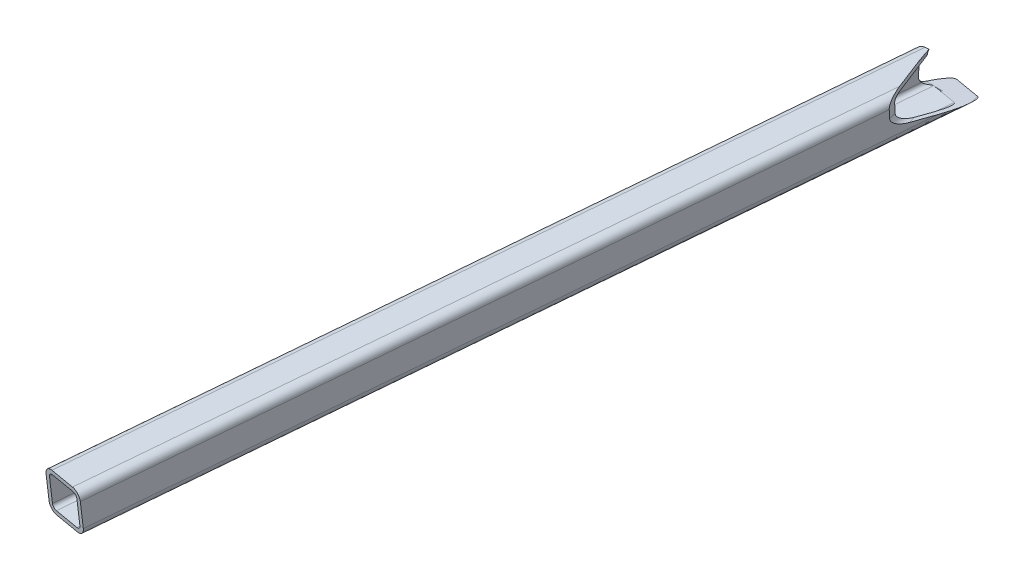
ISO-10303-21;
HEADER;
FILE_DESCRIPTION(('STEP AP214'),'2;1');
FILE_NAME('part.step','',(''),(''),'','','');
FILE_SCHEMA(('AUTOMOTIVE_DESIGN { 1 0 10303 214 1 1 1 1 }'));
ENDSEC;
DATA;
#1=APPLICATION_CONTEXT('core data for automotive mechanical design processes');
#2=APPLICATION_PROTOCOL_DEFINITION('international standard','automotive_design',2000,#1);
#3=PRODUCT_CONTEXT('',#1,'mechanical');
#4=PRODUCT('Part','Part','',(#3));
#5=PRODUCT_RELATED_PRODUCT_CATEGORY('part','',(#4));
#6=PRODUCT_DEFINITION_FORMATION('','',#4);
#7=PRODUCT_DEFINITION_CONTEXT('part definition',#1,'design');
#8=PRODUCT_DEFINITION('design','',#6,#7);
#9=PRODUCT_DEFINITION_SHAPE('','',#8);
#10=(LENGTH_UNIT() NAMED_UNIT(*) SI_UNIT(.MILLI.,.METRE.));
#11=(NAMED_UNIT(*) PLANE_ANGLE_UNIT() SI_UNIT($,.RADIAN.));
#12=(NAMED_UNIT(*) SI_UNIT($,.STERADIAN.) SOLID_ANGLE_UNIT());
#13=UNCERTAINTY_MEASURE_WITH_UNIT(LENGTH_MEASURE(1.E-05),#10,'distance_accuracy_value','');
#14=(GEOMETRIC_REPRESENTATION_CONTEXT(3) GLOBAL_UNCERTAINTY_ASSIGNED_CONTEXT((#13)) GLOBAL_UNIT_ASSIGNED_CONTEXT((#10,
#11,#12)) REPRESENTATION_CONTEXT('',''));
#15=CARTESIAN_POINT('',(0.,0.,0.));
#16=DIRECTION('',(0.,0.,1.));
#17=DIRECTION('',(1.,0.,0.));
#18=AXIS2_PLACEMENT_3D('',#15,#16,#17);
#19=CARTESIAN_POINT('',(54.1032900351574,-73.9281460624987,-1680.60116665924));
#20=DIRECTION('',(0.329210313393401,0.229015870186713,-0.916063480746854));
#21=DIRECTION('',(-0.941074716280074,0.,-0.338198726163151));
#22=AXIS2_PLACEMENT_3D('',#19,#20,#21);
#23=CYLINDRICAL_SURFACE('',#22,4.);
#24=CARTESIAN_POINT('',(165.293495766993,3.42156227269108,-1990.));
#25=DIRECTION('',(0.,0.,-1.));
#26=DIRECTION('',(0.820905201785487,0.5710644881986,0.));
#27=AXIS2_PLACEMENT_3D('',#24,#25,#26);
#28=ELLIPSE('',#27,4.36650961867715,4.);
#29=CARTESIAN_POINT('',(161.046510304216,3.24974629858509,-1990.));
#30=VERTEX_POINT('',#29);
#31=CARTESIAN_POINT('',(162.205924152796,6.00000000000001,-1990.));
#32=VERTEX_POINT('',#31);
#33=EDGE_CURVE('E530',#30,#32,#28,.T.);
#34=ORIENTED_EDGE('',*,*,#33,.F.);
#35=DIRECTION('',(0.329210313393401,0.229015870186713,-0.916063480746854));
#36=VECTOR('',#35,1.);
#37=CARTESIAN_POINT('',(50.3295443978832,-73.7707517232112,-1681.91800791281));
#38=LINE('',#37,#36);
#39=CARTESIAN_POINT('',(49.9999999999999,-73.9999999999996,-1681.00101480566));
#40=VERTEX_POINT('',#39);
#41=EDGE_CURVE('E271',#40,#30,#38,.T.);
#42=ORIENTED_EDGE('',*,*,#41,.F.);
#43=CARTESIAN_POINT('',(53.9999999999999,-73.9999999999996,-1680.31375090924));
#44=DIRECTION('',(-0.168171921974834,-0.116989163112928,0.978790958465303));
#45=DIRECTION('',(0.80349458926477,0.558952757749405,0.204861562101271));
#46=AXIS2_PLACEMENT_3D('',#43,#44,#45);
#47=ELLIPSE('',#46,4.08667444810873,4.);
#48=CARTESIAN_POINT('',(54.,-69.9999999999996,-1679.83565428564));
#49=VERTEX_POINT('',#48);
#50=EDGE_CURVE('E310',#49,#40,#47,.T.);
#51=ORIENTED_EDGE('',*,*,#50,.F.);
#52=DIRECTION('',(0.329210313393401,0.229015870186713,-0.916063480746854));
#53=VECTOR('',#52,1.);
#54=CARTESIAN_POINT('',(53.94589569587,-70.0376377767856,-1679.68510317849));
#55=LINE('',#54,#53);
#56=CARTESIAN_POINT('',(165.589697193477,7.62761543894062,-1990.3461160414));
#57=VERTEX_POINT('',#56);
#58=EDGE_CURVE('E274',#49,#57,#55,.T.);
#59=ORIENTED_EDGE('',*,*,#58,.T.);
#60=CARTESIAN_POINT('',(162.205924152796,6.00000000000001,-1990.));
#61=CARTESIAN_POINT('',(162.297465743592,6.1007657122807,-1990.00003387805));
#62=CARTESIAN_POINT('',(162.393493529026,6.19723632581697,-1990.00380646283));
#63=CARTESIAN_POINT('',(162.593031896537,6.38134727203625,-1990.01714341719));
#64=CARTESIAN_POINT('',(162.696529720715,6.46900207550127,-1990.02669810857));
#65=CARTESIAN_POINT('',(162.910387881736,6.63601157864657,-1990.04998536255));
#66=CARTESIAN_POINT('',(163.020781119878,6.71532072401793,-1990.06373940216));
#67=CARTESIAN_POINT('',(163.247124091024,6.8650970166377,-1990.09392167442));
#68=CARTESIAN_POINT('',(163.363076368465,6.93556006048673,-1990.11035114006));
#69=CARTESIAN_POINT('',(163.599098139199,7.06701379623975,-1990.14434717654));
#70=CARTESIAN_POINT('',(163.719137329081,7.12806100180455,-1990.16190598873));
#71=CARTESIAN_POINT('',(163.963541515791,7.24085913002822,-1990.19687569133));
#72=CARTESIAN_POINT('',(164.087906663519,7.29260972800837,-1990.21428657657));
#73=CARTESIAN_POINT('',(164.34001675291,7.38602889253068,-1990.2474845087));
#74=CARTESIAN_POINT('',(164.467746101468,7.42773714489654,-1990.26327780088));
#75=CARTESIAN_POINT('',(164.726489803195,7.5004562692102,-1990.29187946547));
#76=CARTESIAN_POINT('',(164.857501843146,7.5314744586902,-1990.30468987776));
#77=CARTESIAN_POINT('',(165.088591864016,7.57535323428185,-1990.32322337915));
#78=CARTESIAN_POINT('',(165.188095803454,7.59082324756154,-1990.3299198235));
#79=CARTESIAN_POINT('',(165.388208205972,7.61467927402099,-1990.34036302645));
#80=CARTESIAN_POINT('',(165.488817782184,7.62305732658316,-1990.34410647004));
#81=CARTESIAN_POINT('',(165.589697193477,7.62761543894065,-1990.3461160414));
#82=B_SPLINE_CURVE_WITH_KNOTS('',3,(#60,#61,#62,#63,#64,#65,#66,#67,#68,#69,#70,#71,#72,#73,#74,
#75,#76,#77,#78,#79,#80,#81),.UNSPECIFIED.,.F.,.F.,(4,2,2,2,2,2,2,2,2,2,4),(0.,0.40798949569844,
0.81529797214759,1.22472549541877,1.63434224163022,2.04139583532081,2.44846364236358,
2.85389535824415,3.25904899533167,3.56153390662927,3.86435790407479),.UNSPECIFIED.);
#83=EDGE_CURVE('E361',#32,#57,#82,.T.);
#84=ORIENTED_EDGE('',*,*,#83,.F.);
#85=EDGE_LOOP('',(#34,#42,#51,#59,#84));
#86=FACE_BOUND('',#85,.T.);
#87=ADVANCED_FACE('F41',(#86),#23,.T.);
#88=CARTESIAN_POINT('',(50.8017274157454,-85.4422765803505,-1684.66619835505));
#89=DIRECTION('',(0.94343640931858,-0.039348584821857,0.329210313393401));
#90=DIRECTION('',(0.329465469723453,0.,-0.944167625085665));
#91=AXIS2_PLACEMENT_3D('',#88,#89,#90);
#92=PLANE('',#91);
#93=CARTESIAN_POINT('',(162.056516720495,-6.00000000000001,-1994.));
#94=DIRECTION('',(0.94343640931858,-0.039348584821857,0.329210313393401));
#95=DIRECTION('',(-0.33155352746135,-0.111966498623448,0.936768787702676));
#96=AXIS2_PLACEMENT_3D('',#93,#94,#95);
#97=ELLIPSE('',#96,4.23981940965062,4.);
#98=CARTESIAN_POINT('',(160.948514442533,-8.81842473562878,-1991.16160573394));
#99=VERTEX_POINT('',#98);
#100=CARTESIAN_POINT('',(160.660724443912,-6.,-1990.));
#101=VERTEX_POINT('',#100);
#102=EDGE_CURVE('E282',#99,#101,#97,.F.);
#103=ORIENTED_EDGE('',*,*,#102,.F.);
#104=DIRECTION('',(0.329210313393401,0.229015870186713,-0.916063480746854));
#105=VECTOR('',#104,1.);
#106=CARTESIAN_POINT('',(50.8017274157454,-85.4422765803505,-1684.66619835505));
#107=LINE('',#106,#105);
#108=CARTESIAN_POINT('',(50.,-85.9999999999995,-1682.43530467646));
#109=VERTEX_POINT('',#108);
#110=EDGE_CURVE('E268',#109,#99,#107,.T.);
#111=ORIENTED_EDGE('',*,*,#110,.F.);
#112=DIRECTION('',(0.,-0.992932622114171,-0.118679433523578));
#113=VECTOR('',#112,1.);
#114=CARTESIAN_POINT('',(50.,-85.7130220381919,-1682.40100387781));
#115=LINE('',#114,#113);
#116=EDGE_CURVE('E313',#40,#109,#115,.T.);
#117=ORIENTED_EDGE('',*,*,#116,.F.);
#118=ORIENTED_EDGE('',*,*,#41,.T.);
#119=DIRECTION('',(0.0416714946710183,0.999131366003432,0.));
#120=VECTOR('',#119,1.);
#121=CARTESIAN_POINT('',(157.162350004895,-89.8783360098117,-1990.));
#122=LINE('',#121,#120);
#123=EDGE_CURVE('E531',#101,#30,#122,.T.);
#124=ORIENTED_EDGE('',*,*,#123,.F.);
#125=EDGE_LOOP('',(#103,#111,#117,#118,#124));
#126=FACE_BOUND('',#125,.T.);
#127=ADVANCED_FACE('F357',(#126),#92,.F.);
#128=CARTESIAN_POINT('',(54.5754730530198,-85.599670919638,-1683.34935710148));
#129=DIRECTION('',(0.329210313393401,0.229015870186713,-0.916063480746854));
#130=DIRECTION('',(-0.941074716280074,0.,-0.338198726163151));
#131=AXIS2_PLACEMENT_3D('',#128,#129,#130);
#132=CYLINDRICAL_SURFACE('',#131,4.);
#133=CARTESIAN_POINT('',(162.373354768369,-10.,-1994.));
#134=CARTESIAN_POINT('',(162.312482268875,-9.99996135996605,-1993.87489935749));
#135=CARTESIAN_POINT('',(162.249658701786,-9.99413083001993,-1993.75081611515));
#136=CARTESIAN_POINT('',(162.12173329001,-9.97116634251972,-1993.5048445865));
#137=CARTESIAN_POINT('',(162.056630920958,-9.95402976696814,-1993.38295681528));
#138=CARTESIAN_POINT('',(161.924963897282,-9.90844383026138,-1993.14004928697));
#139=CARTESIAN_POINT('',(161.85839119264,-9.87985242714997,-1993.01906062743));
#140=CARTESIAN_POINT('',(161.726361952706,-9.81136374272716,-1992.77975927288));
#141=CARTESIAN_POINT('',(161.660905134617,-9.77146937244745,-1992.66144589734));
#142=CARTESIAN_POINT('',(161.498933104693,-9.65594730864718,-1992.36568495085));
#143=CARTESIAN_POINT('',(161.40433895344,-9.57258646007895,-1992.19012216393));
#144=CARTESIAN_POINT('',(161.230119248568,-9.37787345788966,-1991.8486771634));
#145=CARTESIAN_POINT('',(161.150391651847,-9.26672538979074,-1991.68273478606));
#146=CARTESIAN_POINT('',(161.056233979188,-9.09179670783813,-1991.46088297955));
#147=CARTESIAN_POINT('',(161.031590058566,-9.04034466382559,-1991.39945882488));
#148=CARTESIAN_POINT('',(160.986611280392,-8.93282345818923,-1991.27876866423));
#149=CARTESIAN_POINT('',(160.966289964396,-8.87674052937455,-1991.21950990842));
#150=CARTESIAN_POINT('',(160.948514442533,-8.81842473562867,-1991.16160573394));
#151=B_SPLINE_CURVE_WITH_KNOTS('',3,(#133,#134,#135,#136,#137,#138,#139,#140,#141,#142,#143,
#144,#145,#146,#147,#148,#149,#150),.UNSPECIFIED.,.F.,.F.,(4,2,2,2,2,2,2,2,4),(0.,
0.417149501995791,0.834395631925075,1.25698427573215,1.67946418239053,2.3258053955008,
2.9675322218104,3.21879294818065,3.47082957732746),.UNSPECIFIED.);
#152=CARTESIAN_POINT('',(162.373354768369,-10.,-1994.));
#153=VERTEX_POINT('',#152);
#154=EDGE_CURVE('E422',#153,#99,#151,.T.);
#155=ORIENTED_EDGE('',*,*,#154,.F.);
#156=CARTESIAN_POINT('',(163.249999999999,-10.,-1985.74804078003));
#157=DIRECTION('',(0.,1.,0.));
#158=DIRECTION('',(0.338198726163151,0.,-0.941074716280074));
#159=AXIS2_PLACEMENT_3D('',#156,#157,#158);
#160=ELLIPSE('',#159,17.4660384747086,4.);
#161=CARTESIAN_POINT('',(168.999999999999,-10.,-2002.22613740363));
#162=VERTEX_POINT('',#161);
#163=EDGE_CURVE('E231',#162,#153,#160,.T.);
#164=ORIENTED_EDGE('',*,*,#163,.F.);
#165=DIRECTION('',(0.329210313393401,0.229015870186713,-0.916063480746854));
#166=VECTOR('',#165,1.);
#167=CARTESIAN_POINT('',(54.7328673923072,-89.4901792053511,-1684.26542058223));
#168=LINE('',#167,#166);
#169=CARTESIAN_POINT('',(53.9999999999999,-89.9999999999996,-1682.22613740363));
#170=VERTEX_POINT('',#169);
#171=EDGE_CURVE('E265',#170,#162,#168,.T.);
#172=ORIENTED_EDGE('',*,*,#171,.F.);
#173=CARTESIAN_POINT('',(54.,-85.9999999999995,-1681.74804078003));
#174=DIRECTION('',(-0.168171921974834,-0.116989163112928,0.978790958465303));
#175=DIRECTION('',(0.80349458926477,0.558952757749405,0.204861562101271));
#176=AXIS2_PLACEMENT_3D('',#173,#174,#175);
#177=ELLIPSE('',#176,4.08667444810873,4.);
#178=EDGE_CURVE('E316',#109,#170,#177,.T.);
#179=ORIENTED_EDGE('',*,*,#178,.F.);
#180=ORIENTED_EDGE('',*,*,#110,.T.);
#181=EDGE_LOOP('',(#155,#164,#172,#179,#180));
#182=FACE_BOUND('',#181,.T.);
#183=ADVANCED_FACE('F429',(#182),#132,.T.);
#184=CARTESIAN_POINT('',(54.1032900351574,-73.9281460624987,-1680.60116665924));
#185=DIRECTION('',(0.329210313393401,0.229015870186713,-0.916063480746854));
#186=DIRECTION('',(-0.941074716280074,0.,-0.338198726163151));
#187=AXIS2_PLACEMENT_3D('',#184,#185,#186);
#188=CYLINDRICAL_SURFACE('',#187,2.);
#189=DIRECTION('',(0.329210313393401,0.229015870186713,-0.916063480746854));
#190=VECTOR('',#189,1.);
#191=CARTESIAN_POINT('',(52.2164172165202,-73.849448892855,-1681.25958728603));
#192=LINE('',#191,#190);
#193=CARTESIAN_POINT('',(51.9999999999999,-73.9999999999995,-1680.65738285745));
#194=VERTEX_POINT('',#193);
#195=CARTESIAN_POINT('',(163.170003035604,3.33565428563821,-1990.));
#196=VERTEX_POINT('',#195);
#197=EDGE_CURVE('E259',#194,#196,#192,.T.);
#198=ORIENTED_EDGE('',*,*,#197,.T.);
#199=CARTESIAN_POINT('',(165.293495766993,3.42156227269108,-1990.));
#200=DIRECTION('',(0.,0.,-1.));
#201=DIRECTION('',(0.820905201785487,0.5710644881986,0.));
#202=AXIS2_PLACEMENT_3D('',#199,#200,#201);
#203=ELLIPSE('',#202,2.18325480933857,2.);
#204=CARTESIAN_POINT('',(165.379403754046,5.481324350641,-1990.));
#205=VERTEX_POINT('',#204);
#206=EDGE_CURVE('E536',#196,#205,#203,.T.);
#207=ORIENTED_EDGE('',*,*,#206,.T.);
#208=DIRECTION('',(0.329210313393401,0.229015870186713,-0.916063480746854));
#209=VECTOR('',#208,1.);
#210=CARTESIAN_POINT('',(54.0245928655137,-71.9828919196421,-1680.14313491887));
#211=LINE('',#210,#209);
#212=CARTESIAN_POINT('',(54.,-71.9999999999996,-1680.07470259744));
#213=VERTEX_POINT('',#212);
#214=EDGE_CURVE('E256',#213,#205,#211,.T.);
#215=ORIENTED_EDGE('',*,*,#214,.F.);
#216=CARTESIAN_POINT('',(53.9999999999999,-73.9999999999996,-1680.31375090924));
#217=DIRECTION('',(-0.168171921974834,-0.116989163112928,0.978790958465303));
#218=DIRECTION('',(0.80349458926477,0.558952757749405,0.204861562101271));
#219=AXIS2_PLACEMENT_3D('',#216,#217,#218);
#220=ELLIPSE('',#219,2.04333722405436,2.);
#221=EDGE_CURVE('E215',#213,#194,#220,.T.);
#222=ORIENTED_EDGE('',*,*,#221,.T.);
#223=EDGE_LOOP('',(#198,#207,#215,#222));
#224=FACE_BOUND('',#223,.T.);
#225=ADVANCED_FACE('F432',(#224),#188,.F.);
#226=CARTESIAN_POINT('',(65.3458297773367,-72.4550749375045,-1676.19261115815));
#227=DIRECTION('',(0.039348584821857,-0.972627071428273,-0.229015870186713));
#228=DIRECTION('',(0.,0.229193370242402,-0.973380911584426));
#229=AXIS2_PLACEMENT_3D('',#226,#227,#228);
#230=PLANE('',#229);
#231=ORIENTED_EDGE('',*,*,#214,.T.);
#232=DIRECTION('',(0.999182659857195,0.0404229172710405,0.));
#233=VECTOR('',#232,1.);
#234=CARTESIAN_POINT('',(62.361444202839,1.31363147157816,-1990.));
#235=LINE('',#234,#233);
#236=CARTESIAN_POINT('',(167.192235935956,5.55466425960822,-1990.));
#237=VERTEX_POINT('',#236);
#238=EDGE_CURVE('E370',#205,#237,#235,.T.);
#239=ORIENTED_EDGE('',*,*,#238,.T.);
#240=DIRECTION('',(0.236939542456569,-0.21357458825435,0.947758169826278));
#241=VECTOR('',#240,1.);
#242=CARTESIAN_POINT('',(235.89119143438,-56.3697869398757,-1715.2041780063));
#243=LINE('',#242,#241);
#244=CARTESIAN_POINT('',(171.675568943719,1.51343926519606,-1972.06666796895));
#245=VERTEX_POINT('',#244);
#246=EDGE_CURVE('E65',#237,#245,#243,.T.);
#247=ORIENTED_EDGE('',*,*,#246,.T.);
#248=DIRECTION('',(0.329210313393401,0.229015870186713,-0.916063480746854));
#249=VECTOR('',#248,1.);
#250=CARTESIAN_POINT('',(65.3458297773367,-72.4550749375045,-1676.19261115815));
#251=LINE('',#250,#249);
#252=CARTESIAN_POINT('',(65.9999999999999,-71.9999999999996,-1678.01291090817));
#253=VERTEX_POINT('',#252);
#254=EDGE_CURVE('E218',#253,#245,#251,.T.);
#255=ORIENTED_EDGE('',*,*,#254,.F.);
#256=DIRECTION('',(-0.985558600813723,0.,-0.169334711037329));
#257=VECTOR('',#256,1.);
#258=CARTESIAN_POINT('',(65.668376130421,-71.9999999999996,-1678.06988918635));
#259=LINE('',#258,#257);
#260=EDGE_CURVE('E214',#253,#213,#259,.T.);
#261=ORIENTED_EDGE('',*,*,#260,.T.);
#262=EDGE_LOOP('',(#231,#239,#247,#255,#261));
#263=FACE_BOUND('',#262,.T.);
#264=ADVANCED_FACE('F402',(#263),#230,.T.);
#265=CARTESIAN_POINT('',(54.5754730530198,-85.599670919638,-1683.34935710148));
#266=DIRECTION('',(0.329210313393401,0.229015870186713,-0.916063480746854));
#267=DIRECTION('',(-0.941074716280074,0.,-0.338198726163151));
#268=AXIS2_PLACEMENT_3D('',#265,#266,#267);
#269=CYLINDRICAL_SURFACE('',#268,2.);
#270=DIRECTION('',(0.329210313393401,0.229015870186713,-0.916063480746854));
#271=VECTOR('',#270,1.);
#272=CARTESIAN_POINT('',(54.6541702226635,-87.5449250624946,-1683.80738884185));
#273=LINE('',#272,#271);
#274=CARTESIAN_POINT('',(54.,-87.9999999999996,-1681.98708909183));
#275=VERTEX_POINT('',#274);
#276=CARTESIAN_POINT('',(166.12502957188,-9.99997942825694,-1993.98717137881));
#277=VERTEX_POINT('',#276);
#278=EDGE_CURVE('E246',#275,#277,#273,.T.);
#279=ORIENTED_EDGE('',*,*,#278,.T.);
#280=CARTESIAN_POINT('',(166.12502957188,-9.99997942825689,-1993.9871713788));
#281=CARTESIAN_POINT('',(166.090832301568,-9.99998274533252,-1993.99307540209));
#282=CARTESIAN_POINT('',(166.056281402746,-9.99999345015904,-1993.99510049495));
#283=CARTESIAN_POINT('',(165.988035871068,-9.99999749670628,-1993.99291413077));
#284=CARTESIAN_POINT('',(165.954338085634,-9.99999118622443,-1993.98882834581));
#285=CARTESIAN_POINT('',(165.868213294209,-9.99991413885472,-1993.97227336039));
#286=CARTESIAN_POINT('',(165.816526796986,-9.99980742384237,-1993.95627003266));
#287=CARTESIAN_POINT('',(165.715323895994,-9.99919431416958,-1993.91735226319));
#288=CARTESIAN_POINT('',(165.665842462472,-9.99868296681079,-1993.89435436972));
#289=CARTESIAN_POINT('',(165.574463932306,-9.99713504881506,-1993.84699260801));
#290=CARTESIAN_POINT('',(165.532335064213,-9.9961631587527,-1993.82306453568));
#291=CARTESIAN_POINT('',(165.449445701829,-9.99363040923188,-1993.77295679707));
#292=CARTESIAN_POINT('',(165.408685946223,-9.99206923722166,-1993.74677594163));
#293=CARTESIAN_POINT('',(165.287890854828,-9.98637753666159,-1993.66576604655));
#294=CARTESIAN_POINT('',(165.209502074776,-9.98124096426783,-1993.60856087839));
#295=CARTESIAN_POINT('',(165.055644076079,-9.96785331357348,-1993.49038401799));
#296=CARTESIAN_POINT('',(164.980182611202,-9.95959451382815,-1993.42940330384));
#297=CARTESIAN_POINT('',(164.831883938573,-9.93966881324213,-1993.30503796889));
#298=CARTESIAN_POINT('',(164.759043895097,-9.92800572757722,-1993.24165610786));
#299=CARTESIAN_POINT('',(164.572879825692,-9.89293117776805,-1993.07475218522));
#300=CARTESIAN_POINT('',(164.461322876497,-9.8666615996176,-1992.96983730794));
#301=CARTESIAN_POINT('',(164.244157733193,-9.803532379783,-1992.75681177822));
#302=CARTESIAN_POINT('',(164.138556031863,-9.76666143699551,-1992.64869782648));
#303=CARTESIAN_POINT('',(163.935075445121,-9.68116310775653,-1992.43070125736));
#304=CARTESIAN_POINT('',(163.837166514019,-9.63258481929262,-1992.32082776992));
#305=CARTESIAN_POINT('',(163.650943691838,-9.52203566120948,-1992.09986980389));
#306=CARTESIAN_POINT('',(163.562614615833,-9.46008646599044,-1991.98878755824));
#307=CARTESIAN_POINT('',(163.402388071814,-9.32380309908266,-1991.77106270901));
#308=CARTESIAN_POINT('',(163.329960190146,-9.25009080396748,-1991.66442750161));
#309=CARTESIAN_POINT('',(163.202254427947,-9.0872094823268,-1991.45309090017));
#310=CARTESIAN_POINT('',(163.146891458279,-8.99812071657402,-1991.34838244271));
#311=CARTESIAN_POINT('',(163.092688836746,-8.87684633257745,-1991.22060959657));
#312=CARTESIAN_POINT('',(163.082577319731,-8.8520348464115,-1991.19515077792));
#313=CARTESIAN_POINT('',(163.063985852239,-8.80140277951154,-1991.14458041183));
#314=CARTESIAN_POINT('',(163.055507870666,-8.77558102562047,-1991.1194693169));
#315=CARTESIAN_POINT('',(163.047918220643,-8.74927428129179,-1991.09457560308));
#316=B_SPLINE_CURVE_WITH_KNOTS('',3,(#280,#281,#282,#283,#284,#285,#286,#287,#288,#289,#290,
#291,#292,#293,#294,#295,#296,#297,#298,#299,#300,#301,#302,#303,#304,#305,#306,#307,#308,#309,
#310,#311,#312,#313,#314,#315),.UNSPECIFIED.,.F.,.F.,(4,2,2,2,2,2,2,2,2,2,2,2,2,2,2,2,2,4),(0.,
0.103445936670636,0.204793523409739,0.366226596349831,0.5296667574315,0.674944469666609,
0.820299344884174,1.11156576403734,1.4035572642332,1.69522277843934,2.16085666987631,
2.62698878124061,3.09119905323662,3.55466241180513,3.9988601041178,4.44080570378759,
4.55164341572931,4.66261389622958),.UNSPECIFIED.);
#317=CARTESIAN_POINT('',(163.047918220643,-8.74927428129176,-1991.09457560308));
#318=VERTEX_POINT('',#317);
#319=EDGE_CURVE('E406',#277,#318,#316,.T.);
#320=ORIENTED_EDGE('',*,*,#319,.T.);
#321=DIRECTION('',(0.329210313393401,0.229015870186713,-0.916063480746854));
#322=VECTOR('',#321,1.);
#323=CARTESIAN_POINT('',(52.6886002343826,-85.5209737499942,-1684.00777772827));
#324=LINE('',#323,#322);
#325=CARTESIAN_POINT('',(51.9999999999999,-85.9999999999996,-1682.09167272825));
#326=VERTEX_POINT('',#325);
#327=EDGE_CURVE('E242',#326,#318,#324,.T.);
#328=ORIENTED_EDGE('',*,*,#327,.F.);
#329=CARTESIAN_POINT('',(54.,-85.9999999999995,-1681.74804078003));
#330=DIRECTION('',(-0.168171921974834,-0.116989163112928,0.978790958465303));
#331=DIRECTION('',(0.80349458926477,0.558952757749405,0.204861562101271));
#332=AXIS2_PLACEMENT_3D('',#329,#330,#331);
#333=ELLIPSE('',#332,2.04333722405436,2.);
#334=EDGE_CURVE('E245',#326,#275,#333,.T.);
#335=ORIENTED_EDGE('',*,*,#334,.T.);
#336=EDGE_LOOP('',(#279,#320,#328,#335));
#337=FACE_BOUND('',#336,.T.);
#338=ADVANCED_FACE('F397',(#337),#269,.F.);
#339=CARTESIAN_POINT('',(52.6886002343826,-85.5209737499942,-1684.00777772827));
#340=DIRECTION('',(0.94343640931858,-0.039348584821857,0.329210313393401));
#341=DIRECTION('',(0.329465469723453,0.,-0.944167625085665));
#342=AXIS2_PLACEMENT_3D('',#339,#340,#341);
#343=PLANE('',#342);
#344=ORIENTED_EDGE('',*,*,#327,.T.);
#345=CARTESIAN_POINT('',(164.17642642532,-6.00000000000001,-1994.));
#346=DIRECTION('',(0.94343640931858,-0.039348584821857,0.329210313393401));
#347=DIRECTION('',(-0.33155352746135,-0.111966498623448,0.936768787702676));
#348=AXIS2_PLACEMENT_3D('',#345,#346,#347);
#349=ELLIPSE('',#348,4.23981940965062,4.);
#350=CARTESIAN_POINT('',(162.780634148737,-5.99999999999999,-1990.));
#351=VERTEX_POINT('',#350);
#352=EDGE_CURVE('E414',#318,#351,#349,.F.);
#353=ORIENTED_EDGE('',*,*,#352,.T.);
#354=DIRECTION('',(0.0416714946710183,0.999131366003432,0.));
#355=VECTOR('',#354,1.);
#356=CARTESIAN_POINT('',(159.278578457966,-89.9665990808206,-1990.));
#357=LINE('',#356,#355);
#358=EDGE_CURVE('E532',#351,#196,#357,.T.);
#359=ORIENTED_EDGE('',*,*,#358,.T.);
#360=ORIENTED_EDGE('',*,*,#197,.F.);
#361=DIRECTION('',(0.,-0.992932622114171,-0.118679433523578));
#362=VECTOR('',#361,1.);
#363=CARTESIAN_POINT('',(51.9999999999999,-85.7535158610237,-1682.06221191959));
#364=LINE('',#363,#362);
#365=EDGE_CURVE('E103',#194,#326,#364,.T.);
#366=ORIENTED_EDGE('',*,*,#365,.T.);
#367=EDGE_LOOP('',(#344,#353,#359,#360,#366));
#368=FACE_BOUND('',#367,.T.);
#369=ADVANCED_FACE('F394',(#368),#343,.T.);
#370=CARTESIAN_POINT('',(169.179144999128,6.00000000000001,-1998.54478624978));
#371=DIRECTION('',(0.242535625036333,0.,0.970142500145332));
#372=DIRECTION('',(0.970142500145332,0.,-0.242535625036333));
#373=AXIS2_PLACEMENT_3D('',#370,#371,#372);
#374=CYLINDRICAL_SURFACE('',#373,4.);
#375=DIRECTION('',(0.242535625036333,0.,0.970142500145332));
#376=VECTOR('',#375,1.);
#377=CARTESIAN_POINT('',(165.298574998547,6.00000000000001,-1997.57464374964));
#378=LINE('',#377,#376);
#379=CARTESIAN_POINT('',(167.192235935956,6.00000000000001,-1990.));
#380=VERTEX_POINT('',#379);
#381=CARTESIAN_POINT('',(168.979424006221,6.00000000000001,-1982.85124771894));
#382=VERTEX_POINT('',#381);
#383=EDGE_CURVE('E225',#380,#382,#378,.T.);
#384=ORIENTED_EDGE('',*,*,#383,.F.);
#385=CARTESIAN_POINT('',(170.315341561574,6.00000000000001,-1994.));
#386=DIRECTION('',(0.788205438016109,0.,0.615412209402636));
#387=DIRECTION('',(-0.615412209402636,0.,0.788205438016109));
#388=AXIS2_PLACEMENT_3D('',#385,#386,#387);
#389=ELLIPSE('',#388,5.07481908532361,4.);
#390=CARTESIAN_POINT('',(167.49347955601,7.713984913022,-1990.38582572115));
#391=VERTEX_POINT('',#390);
#392=EDGE_CURVE('E522',#380,#391,#389,.F.);
#393=ORIENTED_EDGE('',*,*,#392,.T.);
#394=CARTESIAN_POINT('',(173.287582232397,6.00000000000001,-1982.11103731671));
#395=DIRECTION('',(0.039348584821857,-0.972627071428273,-0.229015870186713));
#396=DIRECTION('',(0.256774468722983,-0.21165431976974,0.943010774665294));
#397=AXIS2_PLACEMENT_3D('',#394,#395,#396);
#398=ELLIPSE('',#397,18.8116143333803,4.);
#399=EDGE_CURVE('E91',#391,#382,#398,.F.);
#400=ORIENTED_EDGE('',*,*,#399,.T.);
#401=EDGE_LOOP('',(#384,#393,#400));
#402=FACE_BOUND('',#401,.T.);
#403=ADVANCED_FACE('F43',(#402),#374,.F.);
#404=CARTESIAN_POINT('',(169.179144999128,-6.00000000000001,-1998.54478624978));
#405=DIRECTION('',(0.242535625036333,0.,0.970142500145332));
#406=DIRECTION('',(0.970142500145332,0.,-0.242535625036333));
#407=AXIS2_PLACEMENT_3D('',#404,#405,#406);
#408=CYLINDRICAL_SURFACE('',#407,4.);
#409=DIRECTION('',(0.242535625036333,0.,0.970142500145332));
#410=VECTOR('',#409,1.);
#411=CARTESIAN_POINT('',(169.179144999128,-10.,-1998.54478624978));
#412=LINE('',#411,#410);
#413=CARTESIAN_POINT('',(170.315341561574,-10.,-1994.));
#414=VERTEX_POINT('',#413);
#415=CARTESIAN_POINT('',(170.506784428596,-10.,-1993.23422853191));
#416=VERTEX_POINT('',#415);
#417=EDGE_CURVE('E193',#414,#416,#412,.T.);
#418=ORIENTED_EDGE('',*,*,#417,.F.);
#419=CARTESIAN_POINT('',(170.315341561574,-6.00000000000001,-1994.));
#420=DIRECTION('',(0.788205438016109,0.,0.615412209402636));
#421=DIRECTION('',(-0.615412209402636,0.,0.788205438016109));
#422=AXIS2_PLACEMENT_3D('',#419,#420,#421);
#423=ELLIPSE('',#422,5.07481908532361,4.);
#424=CARTESIAN_POINT('',(169.909817745132,-9.9661365171161,-1993.48061466367));
#425=VERTEX_POINT('',#424);
#426=EDGE_CURVE('E11',#414,#425,#423,.F.);
#427=ORIENTED_EDGE('',*,*,#426,.T.);
#428=CARTESIAN_POINT('',(166.069186409221,-6.00000000000001,-2010.98462060941));
#429=DIRECTION('',(-0.039348584821857,0.972627071428273,0.229015870186713));
#430=DIRECTION('',(0.256774468722983,-0.21165431976974,0.943010774665294));
#431=AXIS2_PLACEMENT_3D('',#428,#429,#430);
#432=ELLIPSE('',#431,18.8116143333803,4.);
#433=EDGE_CURVE('E208',#416,#425,#432,.F.);
#434=ORIENTED_EDGE('',*,*,#433,.F.);
#435=EDGE_LOOP('',(#418,#427,#434));
#436=FACE_BOUND('',#435,.T.);
#437=ADVANCED_FACE('F348',(#436),#408,.F.);
#438=CARTESIAN_POINT('',(65.4245269469804,-74.400329080361,-1676.65064289852));
#439=DIRECTION('',(0.329210313393401,0.229015870186713,-0.916063480746854));
#440=DIRECTION('',(-0.941074716280074,0.,-0.338198726163151));
#441=AXIS2_PLACEMENT_3D('',#438,#439,#440);
#442=CYLINDRICAL_SURFACE('',#441,4.);
#443=CARTESIAN_POINT('',(171.640324641338,-0.511078510373061,-1972.20764517847));
#444=DIRECTION('',(0.970142500145332,0.,-0.242535625036333));
#445=DIRECTION('',(-0.233362342981095,0.272422992664626,-0.933449371924382));
#446=AXIS2_PLACEMENT_3D('',#443,#444,#445);
#447=ELLIPSE('',#446,7.38608425562313,4.);
#448=CARTESIAN_POINT('',(171.7108132461,3.53795704076536,-1971.92569075943));
#449=VERTEX_POINT('',#448);
#450=CARTESIAN_POINT('',(173.382677651708,-2.08161554663735,-1965.23823313699));
#451=VERTEX_POINT('',#450);
#452=EDGE_CURVE('E224',#449,#451,#447,.T.);
#453=ORIENTED_EDGE('',*,*,#452,.F.);
#454=DIRECTION('',(0.329210313393401,0.229015870186713,-0.916063480746854));
#455=VECTOR('',#454,1.);
#456=CARTESIAN_POINT('',(65.267132607693,-70.5098207946479,-1675.73457941777));
#457=LINE('',#456,#455);
#458=CARTESIAN_POINT('',(65.9999999999999,-69.9999999999995,-1677.77386259637));
#459=VERTEX_POINT('',#458);
#460=EDGE_CURVE('E277',#459,#449,#457,.T.);
#461=ORIENTED_EDGE('',*,*,#460,.F.);
#462=CARTESIAN_POINT('',(66.,-73.9999999999996,-1678.25195921997));
#463=DIRECTION('',(-0.168171921974834,-0.116989163112928,0.978790958465303));
#464=DIRECTION('',(0.80349458926477,0.558952757749405,0.204861562101271));
#465=AXIS2_PLACEMENT_3D('',#462,#463,#464);
#466=ELLIPSE('',#465,4.08667444810873,4.);
#467=CARTESIAN_POINT('',(70.,-73.9999999999996,-1677.56469532354));
#468=VERTEX_POINT('',#467);
#469=EDGE_CURVE('E293',#468,#459,#466,.T.);
#470=ORIENTED_EDGE('',*,*,#469,.F.);
#471=DIRECTION('',(0.329210313393401,0.229015870186713,-0.916063480746854));
#472=VECTOR('',#471,1.);
#473=CARTESIAN_POINT('',(69.1982725842548,-74.5577234196484,-1675.33380164495));
#474=LINE('',#473,#472);
#475=EDGE_CURVE('E280',#468,#451,#474,.T.);
#476=ORIENTED_EDGE('',*,*,#475,.T.);
#477=EDGE_LOOP('',(#453,#461,#470,#476));
#478=FACE_BOUND('',#477,.T.);
#479=ADVANCED_FACE('F344',(#478),#442,.T.);
#480=CARTESIAN_POINT('',(65.267132607693,-70.5098207946479,-1675.73457941777));
#481=DIRECTION('',(0.039348584821857,-0.972627071428273,-0.229015870186713));
#482=DIRECTION('',(0.,0.229193370242402,-0.973380911584426));
#483=AXIS2_PLACEMENT_3D('',#480,#481,#482);
#484=PLANE('',#483);
#485=CARTESIAN_POINT('',(104.091672217889,6.00000000000001,-1994.));
#486=DIRECTION('',(0.039348584821857,-0.972627071428273,-0.229015870186713));
#487=DIRECTION('',(-0.999225544545633,-0.0383011613634563,-0.00901843476959045));
#488=AXIS2_PLACEMENT_3D('',#485,#486,#487);
#489=ELLIPSE('',#488,101.655498364407,4.);
#490=EDGE_CURVE('E371',#57,#391,#489,.F.);
#491=ORIENTED_EDGE('',*,*,#490,.F.);
#492=ORIENTED_EDGE('',*,*,#58,.F.);
#493=DIRECTION('',(-0.985558600813723,0.,-0.169334711037329));
#494=VECTOR('',#493,1.);
#495=CARTESIAN_POINT('',(65.6284815295694,-69.9999999999995,-1677.83769540426));
#496=LINE('',#495,#494);
#497=EDGE_CURVE('E307',#459,#49,#496,.T.);
#498=ORIENTED_EDGE('',*,*,#497,.F.);
#499=ORIENTED_EDGE('',*,*,#460,.T.);
#500=DIRECTION('',(0.236939542456569,-0.21357458825435,0.947758169826278));
#501=VECTOR('',#500,1.);
#502=CARTESIAN_POINT('',(235.995248306141,-54.4072960257568,-1714.78795051926));
#503=LINE('',#502,#501);
#504=EDGE_CURVE('E222',#382,#449,#503,.T.);
#505=ORIENTED_EDGE('',*,*,#504,.F.);
#506=ORIENTED_EDGE('',*,*,#399,.F.);
#507=EDGE_LOOP('',(#491,#492,#498,#499,#505,#506));
#508=FACE_BOUND('',#507,.T.);
#509=ADVANCED_FACE('F347',(#508),#484,.F.);
#510=CARTESIAN_POINT('',(54.7328673923072,-89.4901792053511,-1684.26542058223));
#511=DIRECTION('',(-0.039348584821857,0.972627071428273,0.229015870186713));
#512=DIRECTION('',(0.,-0.229193370242402,0.973380911584426));
#513=AXIS2_PLACEMENT_3D('',#510,#511,#512);
#514=PLANE('',#513);
#515=DIRECTION('',(-0.985558600813723,0.,-0.169334711037329));
#516=VECTOR('',#515,1.);
#517=CARTESIAN_POINT('',(111.073626453398,-10.,-2012.17881370097));
#518=LINE('',#517,#516);
#519=CARTESIAN_POINT('',(180.999999999999,-10.,-2000.16434571436));
#520=VERTEX_POINT('',#519);
#521=EDGE_CURVE('E236',#520,#162,#518,.T.);
#522=ORIENTED_EDGE('',*,*,#521,.F.);
#523=DIRECTION('',(0.329210313393401,0.229015870186713,-0.916063480746854));
#524=VECTOR('',#523,1.);
#525=CARTESIAN_POINT('',(66.0541043041301,-89.9623622232134,-1680.31489682151));
#526=LINE('',#525,#524);
#527=CARTESIAN_POINT('',(65.9999999999999,-89.9999999999997,-1680.16434571436));
#528=VERTEX_POINT('',#527);
#529=EDGE_CURVE('E262',#528,#520,#526,.T.);
#530=ORIENTED_EDGE('',*,*,#529,.F.);
#531=DIRECTION('',(0.985558600813723,0.,0.169334711037329));
#532=VECTOR('',#531,1.);
#533=CARTESIAN_POINT('',(54.3715184704307,-89.9999999999996,-1682.16230459574));
#534=LINE('',#533,#532);
#535=EDGE_CURVE('E319',#170,#528,#534,.T.);
#536=ORIENTED_EDGE('',*,*,#535,.F.);
#537=ORIENTED_EDGE('',*,*,#171,.T.);
#538=EDGE_LOOP('',(#522,#530,#536,#537));
#539=FACE_BOUND('',#538,.T.);
#540=ADVANCED_FACE('F352',(#539),#514,.F.);
#541=CARTESIAN_POINT('',(65.8967099648427,-86.0718539375003,-1679.39883334076));
#542=DIRECTION('',(0.329210313393401,0.229015870186713,-0.916063480746854));
#543=DIRECTION('',(-0.941074716280074,0.,-0.338198726163151));
#544=AXIS2_PLACEMENT_3D('',#541,#542,#543);
#545=CYLINDRICAL_SURFACE('',#544,4.);
#546=CARTESIAN_POINT('',(175.249999999999,-10.,-1983.68624909076));
#547=DIRECTION('',(0.,1.,0.));
#548=DIRECTION('',(0.338198726163151,0.,-0.941074716280074));
#549=AXIS2_PLACEMENT_3D('',#546,#547,#548);
#550=ELLIPSE('',#549,17.4660384747086,4.);
#551=CARTESIAN_POINT('',(181.153579698132,-10.,-2000.12431496118));
#552=VERTEX_POINT('',#551);
#553=EDGE_CURVE('E447',#552,#520,#550,.T.);
#554=ORIENTED_EDGE('',*,*,#553,.F.);
#555=CARTESIAN_POINT('',(182.224390049881,-10.,-1995.84107355418));
#556=CARTESIAN_POINT('',(182.231424718943,-10.0000026860393,-1995.96221448319));
#557=CARTESIAN_POINT('',(182.237965242142,-9.9995084339026,-1996.08338531029));
#558=CARTESIAN_POINT('',(182.249863544548,-9.99762310105955,-1996.32578989575));
#559=CARTESIAN_POINT('',(182.255221206398,-9.9962319314182,-1996.44702365917));
#560=CARTESIAN_POINT('',(182.264538384756,-9.99265732162723,-1996.68902734237));
#561=CARTESIAN_POINT('',(182.26850364112,-9.99047721107102,-1996.80979708715));
#562=CARTESIAN_POINT('',(182.274756183161,-9.98545019501887,-1997.0513618028));
#563=CARTESIAN_POINT('',(182.277043550725,-9.98260332207188,-1997.17215677215));
#564=CARTESIAN_POINT('',(182.279924926885,-9.97529669920135,-1997.45703926133));
#565=CARTESIAN_POINT('',(182.279618590802,-9.97062452928947,-1997.62113143947));
#566=CARTESIAN_POINT('',(182.273157445751,-9.96095202319228,-1997.94986480102));
#567=CARTESIAN_POINT('',(182.266980625721,-9.95595051789525,-1998.11450572588));
#568=CARTESIAN_POINT('',(182.250102509879,-9.94909831358628,-1998.36165901951));
#569=CARTESIAN_POINT('',(182.243164179446,-9.94691513391624,-1998.44440872802));
#570=CARTESIAN_POINT('',(182.225720095746,-9.94303901015145,-1998.60953235806));
#571=CARTESIAN_POINT('',(182.215215569298,-9.94134589783744,-1998.69190639896));
#572=CARTESIAN_POINT('',(182.189220603762,-9.93880866683153,-1998.8556554795));
#573=CARTESIAN_POINT('',(182.173745673021,-9.93796194065334,-1998.9370328197));
#574=CARTESIAN_POINT('',(182.135603187765,-9.93759860694857,-1999.0980340364));
#575=CARTESIAN_POINT('',(182.112947737867,-9.93807977136517,-1999.17766062441));
#576=CARTESIAN_POINT('',(182.057478909957,-9.94092697387334,-1999.33290619173));
#577=CARTESIAN_POINT('',(182.024729278214,-9.94328132604723,-1999.40854692735));
#578=CARTESIAN_POINT('',(181.946132481754,-9.95011057767393,-1999.55222710027));
#579=CARTESIAN_POINT('',(181.900372791944,-9.95457144183858,-1999.62031321821));
#580=CARTESIAN_POINT('',(181.795161183804,-9.9648189843247,-1999.74550696802));
#581=CARTESIAN_POINT('',(181.735633488608,-9.9706129991425,-1999.80255050804));
#582=CARTESIAN_POINT('',(181.606278046567,-9.98166743278233,-1999.90443156397));
#583=CARTESIAN_POINT('',(181.53636574557,-9.98692280844337,-1999.94915935384));
#584=CARTESIAN_POINT('',(181.413700920664,-9.99383202995381,-2000.01571730903));
#585=CARTESIAN_POINT('',(181.36241784318,-9.99609818720271,-2000.04033417457));
#586=CARTESIAN_POINT('',(181.258761872709,-9.99918100276679,-2000.08520767279));
#587=CARTESIAN_POINT('',(181.206413777097,-10.0000172279346,-2000.10551977627));
#588=CARTESIAN_POINT('',(181.153579698132,-10.,-2000.12431496118));
#589=B_SPLINE_CURVE_WITH_KNOTS('',3,(#555,#556,#557,#558,#559,#560,#561,#562,#563,#564,#565,
#566,#567,#568,#569,#570,#571,#572,#573,#574,#575,#576,#577,#578,#579,#580,#581,#582,#583,#584,
#585,#586,#587,#588),.UNSPECIFIED.,.F.,.F.,(4,2,2,2,2,2,2,2,2,2,2,2,2,2,2,2,4),(0.,
0.364034805945984,0.728105713798191,1.09065770571588,1.45319200283416,1.9456184714474,
2.43989858077691,2.68905154184762,2.93811887762109,3.18641651750891,3.43429779422331,
3.68064467098081,3.92537285786483,4.17148146575588,4.4197165959753,4.5903361360612,
4.75860170044844),.UNSPECIFIED.);
#590=CARTESIAN_POINT('',(182.224390049881,-10.,-1995.84107355418));
#591=VERTEX_POINT('',#590);
#592=EDGE_CURVE('E232',#591,#552,#589,.T.);
#593=ORIENTED_EDGE('',*,*,#592,.F.);
#594=CARTESIAN_POINT('',(179.249999999999,-10.,-1982.99898519434));
#595=VERTEX_POINT('',#594);
#596=EDGE_CURVE('E206',#595,#591,#550,.T.);
#597=ORIENTED_EDGE('',*,*,#596,.F.);
#598=DIRECTION('',(0.329210313393401,0.229015870186713,-0.916063480746854));
#599=VECTOR('',#598,1.);
#600=CARTESIAN_POINT('',(69.670455602117,-86.2292482767877,-1678.08199208719));
#601=LINE('',#600,#599);
#602=CARTESIAN_POINT('',(70.,-85.9999999999996,-1678.99898519434));
#603=VERTEX_POINT('',#602);
#604=EDGE_CURVE('E238',#603,#595,#601,.T.);
#605=ORIENTED_EDGE('',*,*,#604,.F.);
#606=CARTESIAN_POINT('',(66.,-85.9999999999996,-1679.68624909076));
#607=DIRECTION('',(-0.168171921974834,-0.116989163112928,0.978790958465303));
#608=DIRECTION('',(0.80349458926477,0.558952757749405,0.204861562101271));
#609=AXIS2_PLACEMENT_3D('',#606,#607,#608);
#610=ELLIPSE('',#609,4.08667444810873,4.);
#611=EDGE_CURVE('E322',#528,#603,#610,.T.);
#612=ORIENTED_EDGE('',*,*,#611,.F.);
#613=ORIENTED_EDGE('',*,*,#529,.T.);
#614=EDGE_LOOP('',(#554,#593,#597,#605,#612,#613));
#615=FACE_BOUND('',#614,.T.);
#616=ADVANCED_FACE('F334',(#615),#545,.T.);
#617=CARTESIAN_POINT('',(65.4245269469804,-74.400329080361,-1676.65064289852));
#618=DIRECTION('',(0.329210313393401,0.229015870186713,-0.916063480746854));
#619=DIRECTION('',(-0.941074716280074,0.,-0.338198726163151));
#620=AXIS2_PLACEMENT_3D('',#617,#618,#619);
#621=CYLINDRICAL_SURFACE('',#620,2.);
#622=ORIENTED_EDGE('',*,*,#254,.T.);
#623=CARTESIAN_POINT('',(171.640324641338,-0.511078510373061,-1972.20764517847));
#624=DIRECTION('',(0.970142500145332,0.,-0.242535625036333));
#625=DIRECTION('',(-0.233362342981095,0.272422992664626,-0.933449371924382));
#626=AXIS2_PLACEMENT_3D('',#623,#624,#625);
#627=ELLIPSE('',#626,3.69304212781156,2.);
#628=CARTESIAN_POINT('',(172.511501146523,-1.2963470285052,-1968.72293915773));
#629=VERTEX_POINT('',#628);
#630=EDGE_CURVE('E202',#245,#629,#627,.T.);
#631=ORIENTED_EDGE('',*,*,#630,.T.);
#632=DIRECTION('',(0.329210313393401,0.229015870186713,-0.916063480746854));
#633=VECTOR('',#632,1.);
#634=CARTESIAN_POINT('',(67.3113997656176,-74.4790262500047,-1675.99222227173));
#635=LINE('',#634,#633);
#636=CARTESIAN_POINT('',(68.,-73.9999999999996,-1677.90832727175));
#637=VERTEX_POINT('',#636);
#638=EDGE_CURVE('E221',#637,#629,#635,.T.);
#639=ORIENTED_EDGE('',*,*,#638,.F.);
#640=CARTESIAN_POINT('',(66.,-73.9999999999996,-1678.25195921997));
#641=DIRECTION('',(-0.168171921974834,-0.116989163112928,0.978790958465303));
#642=DIRECTION('',(0.80349458926477,0.558952757749405,0.204861562101271));
#643=AXIS2_PLACEMENT_3D('',#640,#641,#642);
#644=ELLIPSE('',#643,2.04333722405436,2.);
#645=EDGE_CURVE('E199',#637,#253,#644,.T.);
#646=ORIENTED_EDGE('',*,*,#645,.T.);
#647=EDGE_LOOP('',(#622,#631,#639,#646));
#648=FACE_BOUND('',#647,.T.);
#649=ADVANCED_FACE('F440',(#648),#621,.F.);
#650=CARTESIAN_POINT('',(67.3113997656176,-74.4790262500047,-1675.99222227173));
#651=DIRECTION('',(-0.94343640931858,0.039348584821857,-0.329210313393401));
#652=DIRECTION('',(-0.329465469723453,0.,0.944167625085665));
#653=AXIS2_PLACEMENT_3D('',#650,#651,#652);
#654=PLANE('',#653);
#655=CARTESIAN_POINT('',(174.831744176321,-6.00000000000001,-1975.93438954101));
#656=DIRECTION('',(-0.94343640931858,0.039348584821857,-0.329210313393401));
#657=DIRECTION('',(-0.328396754645483,0.0257916469480743,0.944187673339374));
#658=AXIS2_PLACEMENT_3D('',#655,#656,#657);
#659=ELLIPSE('',#658,7.29663561837241,4.);
#660=CARTESIAN_POINT('',(172.429616477679,-6.,-1969.05047783311));
#661=VERTEX_POINT('',#660);
#662=CARTESIAN_POINT('',(174.762109218691,-10.,-1976.21292937153));
#663=VERTEX_POINT('',#662);
#664=EDGE_CURVE('E184',#661,#663,#659,.F.);
#665=ORIENTED_EDGE('',*,*,#664,.T.);
#666=DIRECTION('',(0.329465469723453,0.,-0.944167625085665));
#667=VECTOR('',#666,1.);
#668=CARTESIAN_POINT('',(69.7087592665048,-10.,-1675.15566830285));
#669=LINE('',#668,#667);
#670=CARTESIAN_POINT('',(177.249999999999,-10.,-1983.34261714255));
#671=VERTEX_POINT('',#670);
#672=EDGE_CURVE('E172',#663,#671,#669,.T.);
#673=ORIENTED_EDGE('',*,*,#672,.T.);
#674=DIRECTION('',(0.329210313393401,0.229015870186713,-0.916063480746854));
#675=VECTOR('',#674,1.);
#676=CARTESIAN_POINT('',(67.7835827834798,-86.150551107144,-1678.74041271397));
#677=LINE('',#676,#675);
#678=CARTESIAN_POINT('',(67.9999999999999,-85.9999999999996,-1679.34261714255));
#679=VERTEX_POINT('',#678);
#680=EDGE_CURVE('E220',#679,#671,#677,.T.);
#681=ORIENTED_EDGE('',*,*,#680,.F.);
#682=DIRECTION('',(0.,0.992932622114171,0.118679433523578));
#683=VECTOR('',#682,1.);
#684=CARTESIAN_POINT('',(68.,-74.2464841389754,-1677.93778808041));
#685=LINE('',#684,#683);
#686=EDGE_CURVE('E183',#679,#637,#685,.T.);
#687=ORIENTED_EDGE('',*,*,#686,.T.);
#688=ORIENTED_EDGE('',*,*,#638,.T.);
#689=DIRECTION('',(-0.0173640662442941,-0.997433865706837,-0.0694562649771766));
#690=VECTOR('',#689,1.);
#691=CARTESIAN_POINT('',(171.565340089003,-55.6461213213498,-1972.50758338781));
#692=LINE('',#691,#690);
#693=EDGE_CURVE('E198',#629,#661,#692,.T.);
#694=ORIENTED_EDGE('',*,*,#693,.T.);
#695=EDGE_LOOP('',(#665,#673,#681,#687,#688,#694));
#696=FACE_BOUND('',#695,.T.);
#697=ADVANCED_FACE('F196',(#696),#654,.T.);
#698=CARTESIAN_POINT('',(65.8967099648427,-86.0718539375003,-1679.39883334076));
#699=DIRECTION('',(0.329210313393401,0.229015870186713,-0.916063480746854));
#700=DIRECTION('',(-0.941074716280074,0.,-0.338198726163151));
#701=AXIS2_PLACEMENT_3D('',#698,#699,#700);
#702=CYLINDRICAL_SURFACE('',#701,2.);
#703=ORIENTED_EDGE('',*,*,#680,.T.);
#704=CARTESIAN_POINT('',(175.249999999999,-10.,-1983.68624909076));
#705=DIRECTION('',(0.,1.,0.));
#706=DIRECTION('',(0.338198726163151,0.,-0.941074716280074));
#707=AXIS2_PLACEMENT_3D('',#704,#705,#706);
#708=ELLIPSE('',#707,8.73301923735429,2.);
#709=CARTESIAN_POINT('',(178.124999999999,-9.99999999999997,-1991.92529740256));
#710=VERTEX_POINT('',#709);
#711=EDGE_CURVE('E178',#671,#710,#708,.T.);
#712=ORIENTED_EDGE('',*,*,#711,.T.);
#713=DIRECTION('',(0.329210313393401,0.229015870186713,-0.916063480746854));
#714=VECTOR('',#713,1.);
#715=CARTESIAN_POINT('',(65.9754071344864,-88.0171080803568,-1679.85686508113));
#716=LINE('',#715,#714);
#717=CARTESIAN_POINT('',(66.,-87.9999999999996,-1679.92529740256));
#718=VERTEX_POINT('',#717);
#719=EDGE_CURVE('E241',#718,#710,#716,.T.);
#720=ORIENTED_EDGE('',*,*,#719,.F.);
#721=CARTESIAN_POINT('',(66.,-85.9999999999996,-1679.68624909076));
#722=DIRECTION('',(-0.168171921974834,-0.116989163112928,0.978790958465303));
#723=DIRECTION('',(0.80349458926477,0.558952757749405,0.204861562101271));
#724=AXIS2_PLACEMENT_3D('',#721,#722,#723);
#725=ELLIPSE('',#724,2.04333722405436,2.);
#726=EDGE_CURVE('E249',#718,#679,#725,.T.);
#727=ORIENTED_EDGE('',*,*,#726,.T.);
#728=EDGE_LOOP('',(#703,#712,#720,#727));
#729=FACE_BOUND('',#728,.T.);
#730=ADVANCED_FACE('F471',(#729),#702,.F.);
#731=CARTESIAN_POINT('',(69.1982725842548,-74.5577234196484,-1675.33380164495));
#732=DIRECTION('',(-0.94343640931858,0.039348584821857,-0.329210313393401));
#733=DIRECTION('',(-0.329465469723453,0.,0.944167625085665));
#734=AXIS2_PLACEMENT_3D('',#731,#732,#733);
#735=PLANE('',#734);
#736=DIRECTION('',(0.329465469723453,0.,-0.944167625085665));
#737=VECTOR('',#736,1.);
#738=CARTESIAN_POINT('',(71.5985580816762,-10.,-1674.49622665522));
#739=LINE('',#738,#737);
#740=CARTESIAN_POINT('',(175.646956258873,-10.,-1972.6735412108));
#741=VERTEX_POINT('',#740);
#742=EDGE_CURVE('E192',#741,#595,#739,.T.);
#743=ORIENTED_EDGE('',*,*,#742,.F.);
#744=CARTESIAN_POINT('',(175.716591216503,-6.00000000000001,-1972.39500138028));
#745=DIRECTION('',(-0.94343640931858,0.039348584821857,-0.329210313393401));
#746=DIRECTION('',(-0.328396754645483,0.0257916469480743,0.944187673339374));
#747=AXIS2_PLACEMENT_3D('',#744,#745,#746);
#748=ELLIPSE('',#747,7.29663561837241,4.);
#749=CARTESIAN_POINT('',(173.314463517861,-5.99999999999999,-1965.51108967238));
#750=VERTEX_POINT('',#749);
#751=EDGE_CURVE('E191',#750,#741,#748,.F.);
#752=ORIENTED_EDGE('',*,*,#751,.F.);
#753=DIRECTION('',(-0.0173640662442941,-0.997433865706837,-0.0694562649771766));
#754=VECTOR('',#753,1.);
#755=CARTESIAN_POINT('',(172.445651683275,-55.906648278765,-1968.98633701072));
#756=LINE('',#755,#754);
#757=EDGE_CURVE('E228',#451,#750,#756,.T.);
#758=ORIENTED_EDGE('',*,*,#757,.F.);
#759=ORIENTED_EDGE('',*,*,#475,.F.);
#760=DIRECTION('',(0.,0.992932622114171,0.118679433523578));
#761=VECTOR('',#760,1.);
#762=CARTESIAN_POINT('',(70.,-74.2869779618071,-1677.59899612219));
#763=LINE('',#762,#761);
#764=EDGE_CURVE('E290',#603,#468,#763,.T.);
#765=ORIENTED_EDGE('',*,*,#764,.F.);
#766=ORIENTED_EDGE('',*,*,#604,.T.);
#767=EDGE_LOOP('',(#743,#752,#758,#759,#765,#766));
#768=FACE_BOUND('',#767,.T.);
#769=ADVANCED_FACE('F476',(#768),#735,.F.);
#770=CARTESIAN_POINT('',(54.6541702226635,-87.5449250624946,-1683.80738884185));
#771=DIRECTION('',(-0.039348584821857,0.972627071428273,0.229015870186713));
#772=DIRECTION('',(0.,-0.229193370242402,0.973380911584426));
#773=AXIS2_PLACEMENT_3D('',#770,#771,#772);
#774=PLANE('',#773);
#775=ORIENTED_EDGE('',*,*,#433,.T.);
#776=CARTESIAN_POINT('',(264.922745851457,-6.00000000000001,-1994.));
#777=DIRECTION('',(-0.039348584821857,0.972627071428273,0.229015870186713));
#778=DIRECTION('',(-0.999225544545633,-0.0383011613634563,-0.00901843476959045));
#779=AXIS2_PLACEMENT_3D('',#776,#777,#778);
#780=ELLIPSE('',#779,101.655498364407,4.);
#781=EDGE_CURVE('E415',#425,#277,#780,.F.);
#782=ORIENTED_EDGE('',*,*,#781,.T.);
#783=ORIENTED_EDGE('',*,*,#278,.F.);
#784=DIRECTION('',(0.985558600813723,0.,0.169334711037329));
#785=VECTOR('',#784,1.);
#786=CARTESIAN_POINT('',(54.3316238695791,-87.9999999999996,-1681.93011081365));
#787=LINE('',#786,#785);
#788=EDGE_CURVE('E211',#275,#718,#787,.T.);
#789=ORIENTED_EDGE('',*,*,#788,.T.);
#790=ORIENTED_EDGE('',*,*,#719,.T.);
#791=DIRECTION('',(-0.985558600813723,0.,-0.169334711037329));
#792=VECTOR('',#791,1.);
#793=CARTESIAN_POINT('',(109.616179152972,-10.,-2003.69620719124));
#794=LINE('',#793,#792);
#795=EDGE_CURVE('E212',#710,#416,#794,.T.);
#796=ORIENTED_EDGE('',*,*,#795,.T.);
#797=EDGE_LOOP('',(#775,#782,#783,#789,#790,#796));
#798=FACE_BOUND('',#797,.T.);
#799=ADVANCED_FACE('F384',(#798),#774,.T.);
#800=CARTESIAN_POINT('',(60.,-80.,-1680.));
#801=DIRECTION('',(-0.168171921974834,-0.116989163112928,0.978790958465303));
#802=DIRECTION('',(0.985558600813723,0.,0.169334711037329));
#803=AXIS2_PLACEMENT_3D('',#800,#801,#802);
#804=PLANE('',#803);
#805=ORIENTED_EDGE('',*,*,#221,.F.);
#806=ORIENTED_EDGE('',*,*,#260,.F.);
#807=ORIENTED_EDGE('',*,*,#645,.F.);
#808=ORIENTED_EDGE('',*,*,#686,.F.);
#809=ORIENTED_EDGE('',*,*,#726,.F.);
#810=ORIENTED_EDGE('',*,*,#788,.F.);
#811=ORIENTED_EDGE('',*,*,#334,.F.);
#812=ORIENTED_EDGE('',*,*,#365,.F.);
#813=EDGE_LOOP('',(#805,#806,#807,#808,#809,#810,#811,#812));
#814=FACE_BOUND('',#813,.T.);
#815=ORIENTED_EDGE('',*,*,#764,.T.);
#816=ORIENTED_EDGE('',*,*,#469,.T.);
#817=ORIENTED_EDGE('',*,*,#497,.T.);
#818=ORIENTED_EDGE('',*,*,#50,.T.);
#819=ORIENTED_EDGE('',*,*,#116,.T.);
#820=ORIENTED_EDGE('',*,*,#178,.T.);
#821=ORIENTED_EDGE('',*,*,#535,.T.);
#822=ORIENTED_EDGE('',*,*,#611,.T.);
#823=EDGE_LOOP('',(#815,#816,#817,#818,#819,#820,#821,#822));
#824=FACE_BOUND('',#823,.T.);
#825=ADVANCED_FACE('F342',(#814,#824),#804,.T.);
#826=CARTESIAN_POINT('',(180.820855000872,-6.00000000000001,-2001.45521375022));
#827=DIRECTION('',(0.242535625036333,0.,0.970142500145332));
#828=DIRECTION('',(0.970142500145332,0.,-0.242535625036333));
#829=AXIS2_PLACEMENT_3D('',#826,#827,#828);
#830=CYLINDRICAL_SURFACE('',#829,4.);
#831=ORIENTED_EDGE('',*,*,#592,.T.);
#832=DIRECTION('',(0.242535625036333,0.,0.970142500145332));
#833=VECTOR('',#832,1.);
#834=CARTESIAN_POINT('',(180.820855000872,-10.,-2001.45521375022));
#835=LINE('',#834,#833);
#836=EDGE_CURVE('E229',#552,#591,#835,.T.);
#837=ORIENTED_EDGE('',*,*,#836,.T.);
#838=EDGE_LOOP('',(#831,#837));
#839=FACE_BOUND('',#838,.T.);
#840=ADVANCED_FACE('F338',(#839),#830,.F.);
#841=CARTESIAN_POINT('',(180.820855000872,-10.,-2001.45521375022));
#842=DIRECTION('',(0.,1.,0.));
#843=DIRECTION('',(0.,0.,1.));
#844=AXIS2_PLACEMENT_3D('',#841,#842,#843);
#845=PLANE('',#844);
#846=ORIENTED_EDGE('',*,*,#553,.T.);
#847=ORIENTED_EDGE('',*,*,#521,.T.);
#848=ORIENTED_EDGE('',*,*,#163,.T.);
#849=DIRECTION('',(-1.,0.,0.));
#850=VECTOR('',#849,1.);
#851=CARTESIAN_POINT('',(175.,-10.,-1994.));
#852=LINE('',#851,#850);
#853=EDGE_CURVE('E463',#414,#153,#852,.T.);
#854=ORIENTED_EDGE('',*,*,#853,.F.);
#855=ORIENTED_EDGE('',*,*,#417,.T.);
#856=ORIENTED_EDGE('',*,*,#795,.F.);
#857=ORIENTED_EDGE('',*,*,#711,.F.);
#858=ORIENTED_EDGE('',*,*,#672,.F.);
#859=EDGE_CURVE('E175',#663,#741,#412,.T.);
#860=ORIENTED_EDGE('',*,*,#859,.T.);
#861=ORIENTED_EDGE('',*,*,#742,.T.);
#862=ORIENTED_EDGE('',*,*,#596,.T.);
#863=ORIENTED_EDGE('',*,*,#836,.F.);
#864=EDGE_LOOP('',(#846,#847,#848,#854,#855,#856,#857,#858,#860,#861,#862,#863));
#865=FACE_BOUND('',#864,.T.);
#866=ADVANCED_FACE('F174',(#865),#845,.T.);
#867=DIRECTION('',(0.242535625036333,0.,0.970142500145332));
#868=VECTOR('',#867,1.);
#869=CARTESIAN_POINT('',(165.298574998547,-6.00000000000001,-1997.57464374964));
#870=LINE('',#869,#868);
#871=EDGE_CURVE('E234',#661,#750,#870,.T.);
#872=ORIENTED_EDGE('',*,*,#871,.T.);
#873=ORIENTED_EDGE('',*,*,#751,.T.);
#874=ORIENTED_EDGE('',*,*,#859,.F.);
#875=ORIENTED_EDGE('',*,*,#664,.F.);
#876=EDGE_LOOP('',(#872,#873,#874,#875));
#877=FACE_BOUND('',#876,.T.);
#878=ADVANCED_FACE('F188',(#877),#408,.F.);
#879=CARTESIAN_POINT('',(165.298574998547,6.00000000000001,-1997.57464374964));
#880=DIRECTION('',(0.970142500145332,0.,-0.242535625036333));
#881=DIRECTION('',(-0.242535625036333,0.,-0.970142500145332));
#882=AXIS2_PLACEMENT_3D('',#879,#880,#881);
#883=PLANE('',#882);
#884=ORIENTED_EDGE('',*,*,#246,.F.);
#885=DIRECTION('',(0.,1.,0.));
#886=VECTOR('',#885,1.);
#887=CARTESIAN_POINT('',(167.192235935956,6.00000000000001,-1990.));
#888=LINE('',#887,#886);
#889=EDGE_CURVE('E49',#237,#380,#888,.T.);
#890=ORIENTED_EDGE('',*,*,#889,.T.);
#891=ORIENTED_EDGE('',*,*,#383,.T.);
#892=ORIENTED_EDGE('',*,*,#504,.T.);
#893=ORIENTED_EDGE('',*,*,#452,.T.);
#894=ORIENTED_EDGE('',*,*,#757,.T.);
#895=ORIENTED_EDGE('',*,*,#871,.F.);
#896=ORIENTED_EDGE('',*,*,#693,.F.);
#897=ORIENTED_EDGE('',*,*,#630,.F.);
#898=EDGE_LOOP('',(#884,#890,#891,#892,#893,#894,#895,#896,#897));
#899=FACE_BOUND('',#898,.T.);
#900=ADVANCED_FACE('F390',(#899),#883,.T.);
#901=CARTESIAN_POINT('',(175.,-6.00000000000001,-1994.));
#902=DIRECTION('',(-1.,0.,0.));
#903=DIRECTION('',(0.,0.,1.));
#904=AXIS2_PLACEMENT_3D('',#901,#902,#903);
#905=CYLINDRICAL_SURFACE('',#904,4.);
#906=ORIENTED_EDGE('',*,*,#102,.T.);
#907=DIRECTION('',(-1.,0.,0.));
#908=VECTOR('',#907,1.);
#909=CARTESIAN_POINT('',(175.,-6.00000000000001,-1990.));
#910=LINE('',#909,#908);
#911=EDGE_CURVE('E523',#351,#101,#910,.T.);
#912=ORIENTED_EDGE('',*,*,#911,.F.);
#913=ORIENTED_EDGE('',*,*,#352,.F.);
#914=ORIENTED_EDGE('',*,*,#319,.F.);
#915=ORIENTED_EDGE('',*,*,#781,.F.);
#916=ORIENTED_EDGE('',*,*,#426,.F.);
#917=ORIENTED_EDGE('',*,*,#853,.T.);
#918=ORIENTED_EDGE('',*,*,#154,.T.);
#919=EDGE_LOOP('',(#906,#912,#913,#914,#915,#916,#917,#918));
#920=FACE_BOUND('',#919,.T.);
#921=ADVANCED_FACE('F393',(#920),#905,.F.);
#922=CARTESIAN_POINT('',(175.,-6.00000000000001,-1990.));
#923=DIRECTION('',(0.,0.,-1.));
#924=DIRECTION('',(-1.,0.,0.));
#925=AXIS2_PLACEMENT_3D('',#922,#923,#924);
#926=PLANE('',#925);
#927=ORIENTED_EDGE('',*,*,#33,.T.);
#928=DIRECTION('',(-1.,0.,0.));
#929=VECTOR('',#928,1.);
#930=CARTESIAN_POINT('',(175.,6.00000000000001,-1990.));
#931=LINE('',#930,#929);
#932=EDGE_CURVE('E56',#380,#32,#931,.T.);
#933=ORIENTED_EDGE('',*,*,#932,.F.);
#934=ORIENTED_EDGE('',*,*,#889,.F.);
#935=ORIENTED_EDGE('',*,*,#238,.F.);
#936=ORIENTED_EDGE('',*,*,#206,.F.);
#937=ORIENTED_EDGE('',*,*,#358,.F.);
#938=ORIENTED_EDGE('',*,*,#911,.T.);
#939=ORIENTED_EDGE('',*,*,#123,.T.);
#940=EDGE_LOOP('',(#927,#933,#934,#935,#936,#937,#938,#939));
#941=FACE_BOUND('',#940,.T.);
#942=ADVANCED_FACE('F379',(#941),#926,.T.);
#943=CARTESIAN_POINT('',(175.,6.00000000000001,-1994.));
#944=DIRECTION('',(-1.,0.,0.));
#945=DIRECTION('',(0.,0.,1.));
#946=AXIS2_PLACEMENT_3D('',#943,#944,#945);
#947=CYLINDRICAL_SURFACE('',#946,4.);
#948=ORIENTED_EDGE('',*,*,#83,.T.);
#949=ORIENTED_EDGE('',*,*,#490,.T.);
#950=ORIENTED_EDGE('',*,*,#392,.F.);
#951=ORIENTED_EDGE('',*,*,#932,.T.);
#952=EDGE_LOOP('',(#948,#949,#950,#951));
#953=FACE_BOUND('',#952,.T.);
#954=ADVANCED_FACE('F374',(#953),#947,.F.);
#955=CLOSED_SHELL('',(#87,#127,#183,#225,#264,#338,#369,#403,#437,#479,#509,#540,#616,#649,#697,
#730,#769,#799,#825,#840,#866,#878,#900,#921,#942,#954));
#956=MANIFOLD_SOLID_BREP('B2',#955);
#957=ADVANCED_BREP_SHAPE_REPRESENTATION('',(#18,#956),#14);
#958=SHAPE_DEFINITION_REPRESENTATION(#9,#957);
ENDSEC;
END-ISO-10303-21;
